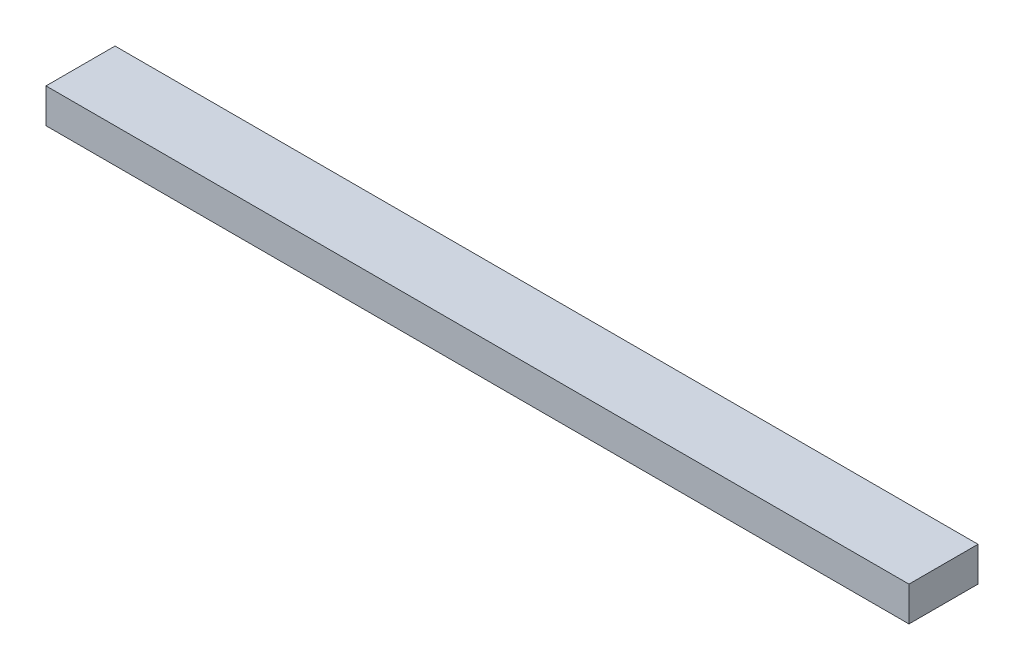
ISO-10303-21;
HEADER;
FILE_DESCRIPTION(('STEP AP214'),'2;1');
FILE_NAME('part.step','',(''),(''),'','','');
FILE_SCHEMA(('AUTOMOTIVE_DESIGN { 1 0 10303 214 1 1 1 1 }'));
ENDSEC;
DATA;
#1=APPLICATION_CONTEXT('core data for automotive mechanical design processes');
#2=APPLICATION_PROTOCOL_DEFINITION('international standard','automotive_design',2000,#1);
#3=PRODUCT_CONTEXT('',#1,'mechanical');
#4=PRODUCT('Part','Part','',(#3));
#5=PRODUCT_RELATED_PRODUCT_CATEGORY('part','',(#4));
#6=PRODUCT_DEFINITION_FORMATION('','',#4);
#7=PRODUCT_DEFINITION_CONTEXT('part definition',#1,'design');
#8=PRODUCT_DEFINITION('design','',#6,#7);
#9=PRODUCT_DEFINITION_SHAPE('','',#8);
#10=(LENGTH_UNIT() NAMED_UNIT(*) SI_UNIT(.MILLI.,.METRE.));
#11=(NAMED_UNIT(*) PLANE_ANGLE_UNIT() SI_UNIT($,.RADIAN.));
#12=(NAMED_UNIT(*) SI_UNIT($,.STERADIAN.) SOLID_ANGLE_UNIT());
#13=UNCERTAINTY_MEASURE_WITH_UNIT(LENGTH_MEASURE(1.E-05),#10,'distance_accuracy_value','');
#14=(GEOMETRIC_REPRESENTATION_CONTEXT(3) GLOBAL_UNCERTAINTY_ASSIGNED_CONTEXT((#13)) GLOBAL_UNIT_ASSIGNED_CONTEXT((#10,
#11,#12)) REPRESENTATION_CONTEXT('',''));
#15=CARTESIAN_POINT('',(0.,0.,0.));
#16=DIRECTION('',(0.,0.,1.));
#17=DIRECTION('',(1.,0.,0.));
#18=AXIS2_PLACEMENT_3D('',#15,#16,#17);
#19=CARTESIAN_POINT('',(25.,-1.,4.));
#20=DIRECTION('',(-1.,0.,0.));
#21=DIRECTION('',(0.,0.,1.));
#22=AXIS2_PLACEMENT_3D('',#19,#20,#21);
#23=PLANE('',#22);
#24=DIRECTION('',(0.,1.,0.));
#25=VECTOR('',#24,1.);
#26=CARTESIAN_POINT('',(25.,-1.,0.));
#27=LINE('',#26,#25);
#28=CARTESIAN_POINT('',(25.,-1.,0.));
#29=VERTEX_POINT('',#28);
#30=CARTESIAN_POINT('',(25.,0.999999999999997,0.));
#31=VERTEX_POINT('',#30);
#32=EDGE_CURVE('E96',#29,#31,#27,.T.);
#33=ORIENTED_EDGE('',*,*,#32,.T.);
#34=DIRECTION('',(0.,0.,-1.));
#35=VECTOR('',#34,1.);
#36=CARTESIAN_POINT('',(25.,0.999999999999997,4.));
#37=LINE('',#36,#35);
#38=CARTESIAN_POINT('',(25.,0.999999999999997,4.));
#39=VERTEX_POINT('',#38);
#40=EDGE_CURVE('E11',#39,#31,#37,.T.);
#41=ORIENTED_EDGE('',*,*,#40,.F.);
#42=DIRECTION('',(0.,1.,0.));
#43=VECTOR('',#42,1.);
#44=CARTESIAN_POINT('',(25.,-1.,4.));
#45=LINE('',#44,#43);
#46=CARTESIAN_POINT('',(25.,-1.,4.));
#47=VERTEX_POINT('',#46);
#48=EDGE_CURVE('E84',#47,#39,#45,.T.);
#49=ORIENTED_EDGE('',*,*,#48,.F.);
#50=DIRECTION('',(0.,0.,-1.));
#51=VECTOR('',#50,1.);
#52=CARTESIAN_POINT('',(25.,-1.,4.));
#53=LINE('',#52,#51);
#54=EDGE_CURVE('E92',#47,#29,#53,.T.);
#55=ORIENTED_EDGE('',*,*,#54,.T.);
#56=EDGE_LOOP('',(#33,#41,#49,#55));
#57=FACE_BOUND('',#56,.T.);
#58=ADVANCED_FACE('F33',(#57),#23,.F.);
#59=CARTESIAN_POINT('',(-25.,0.999999999999997,4.));
#60=DIRECTION('',(0.,-1.,0.));
#61=DIRECTION('',(0.,0.,-1.));
#62=AXIS2_PLACEMENT_3D('',#59,#60,#61);
#63=PLANE('',#62);
#64=DIRECTION('',(-1.,0.,0.));
#65=VECTOR('',#64,1.);
#66=CARTESIAN_POINT('',(-25.,0.999999999999997,0.));
#67=LINE('',#66,#65);
#68=CARTESIAN_POINT('',(-25.,0.999999999999997,0.));
#69=VERTEX_POINT('',#68);
#70=EDGE_CURVE('E88',#31,#69,#67,.T.);
#71=ORIENTED_EDGE('',*,*,#70,.T.);
#72=DIRECTION('',(0.,0.,-1.));
#73=VECTOR('',#72,1.);
#74=CARTESIAN_POINT('',(-25.,0.999999999999997,4.));
#75=LINE('',#74,#73);
#76=CARTESIAN_POINT('',(-25.,0.999999999999997,4.));
#77=VERTEX_POINT('',#76);
#78=EDGE_CURVE('E41',#77,#69,#75,.T.);
#79=ORIENTED_EDGE('',*,*,#78,.F.);
#80=DIRECTION('',(-1.,0.,0.));
#81=VECTOR('',#80,1.);
#82=CARTESIAN_POINT('',(-25.,0.999999999999997,4.));
#83=LINE('',#82,#81);
#84=EDGE_CURVE('E79',#39,#77,#83,.T.);
#85=ORIENTED_EDGE('',*,*,#84,.F.);
#86=ORIENTED_EDGE('',*,*,#40,.T.);
#87=EDGE_LOOP('',(#71,#79,#85,#86));
#88=FACE_BOUND('',#87,.T.);
#89=ADVANCED_FACE('F87',(#88),#63,.F.);
#90=CARTESIAN_POINT('',(-25.,-1.,4.));
#91=DIRECTION('',(1.,0.,0.));
#92=DIRECTION('',(0.,0.,-1.));
#93=AXIS2_PLACEMENT_3D('',#90,#91,#92);
#94=PLANE('',#93);
#95=DIRECTION('',(0.,-1.,0.));
#96=VECTOR('',#95,1.);
#97=CARTESIAN_POINT('',(-25.,-1.,0.));
#98=LINE('',#97,#96);
#99=CARTESIAN_POINT('',(-25.,-1.,0.));
#100=VERTEX_POINT('',#99);
#101=EDGE_CURVE('E66',#69,#100,#98,.T.);
#102=ORIENTED_EDGE('',*,*,#101,.T.);
#103=DIRECTION('',(0.,0.,-1.));
#104=VECTOR('',#103,1.);
#105=CARTESIAN_POINT('',(-25.,-1.,4.));
#106=LINE('',#105,#104);
#107=CARTESIAN_POINT('',(-25.,-1.,4.));
#108=VERTEX_POINT('',#107);
#109=EDGE_CURVE('E89',#108,#100,#106,.T.);
#110=ORIENTED_EDGE('',*,*,#109,.F.);
#111=DIRECTION('',(0.,-1.,0.));
#112=VECTOR('',#111,1.);
#113=CARTESIAN_POINT('',(-25.,-1.,4.));
#114=LINE('',#113,#112);
#115=EDGE_CURVE('E82',#77,#108,#114,.T.);
#116=ORIENTED_EDGE('',*,*,#115,.F.);
#117=ORIENTED_EDGE('',*,*,#78,.T.);
#118=EDGE_LOOP('',(#102,#110,#116,#117));
#119=FACE_BOUND('',#118,.T.);
#120=ADVANCED_FACE('F90',(#119),#94,.F.);
#121=CARTESIAN_POINT('',(-25.,-1.,4.));
#122=DIRECTION('',(0.,1.,0.));
#123=DIRECTION('',(0.,0.,1.));
#124=AXIS2_PLACEMENT_3D('',#121,#122,#123);
#125=PLANE('',#124);
#126=DIRECTION('',(1.,0.,0.));
#127=VECTOR('',#126,1.);
#128=CARTESIAN_POINT('',(-25.,-1.,0.));
#129=LINE('',#128,#127);
#130=EDGE_CURVE('E72',#100,#29,#129,.T.);
#131=ORIENTED_EDGE('',*,*,#130,.T.);
#132=ORIENTED_EDGE('',*,*,#54,.F.);
#133=DIRECTION('',(1.,0.,0.));
#134=VECTOR('',#133,1.);
#135=CARTESIAN_POINT('',(-25.,-1.,4.));
#136=LINE('',#135,#134);
#137=EDGE_CURVE('E49',#108,#47,#136,.T.);
#138=ORIENTED_EDGE('',*,*,#137,.F.);
#139=ORIENTED_EDGE('',*,*,#109,.T.);
#140=EDGE_LOOP('',(#131,#132,#138,#139));
#141=FACE_BOUND('',#140,.T.);
#142=ADVANCED_FACE('F103',(#141),#125,.F.);
#143=CARTESIAN_POINT('',(0.,0.,4.));
#144=DIRECTION('',(0.,0.,-1.));
#145=DIRECTION('',(-1.,0.,0.));
#146=AXIS2_PLACEMENT_3D('',#143,#144,#145);
#147=PLANE('',#146);
#148=ORIENTED_EDGE('',*,*,#48,.T.);
#149=ORIENTED_EDGE('',*,*,#84,.T.);
#150=ORIENTED_EDGE('',*,*,#115,.T.);
#151=ORIENTED_EDGE('',*,*,#137,.T.);
#152=EDGE_LOOP('',(#148,#149,#150,#151));
#153=FACE_BOUND('',#152,.T.);
#154=ADVANCED_FACE('F80',(#153),#147,.F.);
#155=CARTESIAN_POINT('',(0.,0.,0.));
#156=DIRECTION('',(0.,0.,-1.));
#157=DIRECTION('',(-1.,0.,0.));
#158=AXIS2_PLACEMENT_3D('',#155,#156,#157);
#159=PLANE('',#158);
#160=ORIENTED_EDGE('',*,*,#32,.F.);
#161=ORIENTED_EDGE('',*,*,#130,.F.);
#162=ORIENTED_EDGE('',*,*,#101,.F.);
#163=ORIENTED_EDGE('',*,*,#70,.F.);
#164=EDGE_LOOP('',(#160,#161,#162,#163));
#165=FACE_BOUND('',#164,.T.);
#166=ADVANCED_FACE('F106',(#165),#159,.T.);
#167=CLOSED_SHELL('',(#58,#89,#120,#142,#154,#166));
#168=MANIFOLD_SOLID_BREP('B2',#167);
#169=ADVANCED_BREP_SHAPE_REPRESENTATION('',(#18,#168),#14);
#170=SHAPE_DEFINITION_REPRESENTATION(#9,#169);
ENDSEC;
END-ISO-10303-21;
